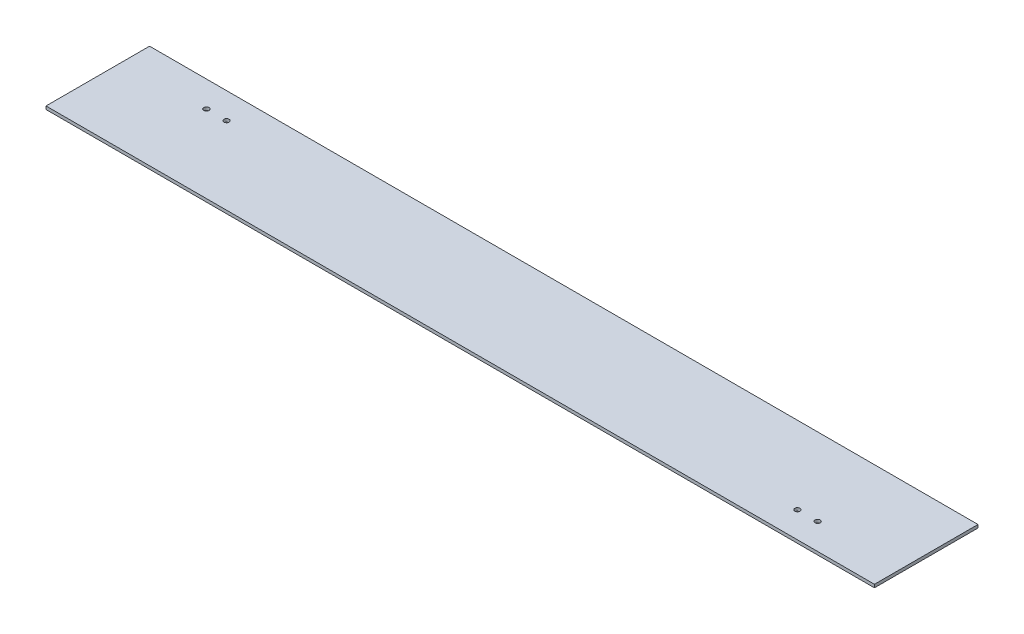
ISO-10303-21;
HEADER;
FILE_DESCRIPTION(('STEP AP214'),'2;1');
FILE_NAME('part.step','',(''),(''),'','','');
FILE_SCHEMA(('AUTOMOTIVE_DESIGN { 1 0 10303 214 1 1 1 1 }'));
ENDSEC;
DATA;
#1=APPLICATION_CONTEXT('core data for automotive mechanical design processes');
#2=APPLICATION_PROTOCOL_DEFINITION('international standard','automotive_design',2000,#1);
#3=PRODUCT_CONTEXT('',#1,'mechanical');
#4=PRODUCT('Part','Part','',(#3));
#5=PRODUCT_RELATED_PRODUCT_CATEGORY('part','',(#4));
#6=PRODUCT_DEFINITION_FORMATION('','',#4);
#7=PRODUCT_DEFINITION_CONTEXT('part definition',#1,'design');
#8=PRODUCT_DEFINITION('design','',#6,#7);
#9=PRODUCT_DEFINITION_SHAPE('','',#8);
#10=(LENGTH_UNIT() NAMED_UNIT(*) SI_UNIT(.MILLI.,.METRE.));
#11=(NAMED_UNIT(*) PLANE_ANGLE_UNIT() SI_UNIT($,.RADIAN.));
#12=(NAMED_UNIT(*) SI_UNIT($,.STERADIAN.) SOLID_ANGLE_UNIT());
#13=UNCERTAINTY_MEASURE_WITH_UNIT(LENGTH_MEASURE(1.E-05),#10,'distance_accuracy_value','');
#14=(GEOMETRIC_REPRESENTATION_CONTEXT(3) GLOBAL_UNCERTAINTY_ASSIGNED_CONTEXT((#13)) GLOBAL_UNIT_ASSIGNED_CONTEXT((#10,
#11,#12)) REPRESENTATION_CONTEXT('',''));
#15=CARTESIAN_POINT('',(0.,0.,0.));
#16=DIRECTION('',(0.,0.,1.));
#17=DIRECTION('',(1.,0.,0.));
#18=AXIS2_PLACEMENT_3D('',#15,#16,#17);
#19=CARTESIAN_POINT('',(0.,3.,0.));
#20=DIRECTION('',(-1.,0.,0.));
#21=DIRECTION('',(0.,0.,1.));
#22=AXIS2_PLACEMENT_3D('',#19,#20,#21);
#23=PLANE('',#22);
#24=DIRECTION('',(0.,0.,-1.));
#25=VECTOR('',#24,1.);
#26=CARTESIAN_POINT('',(0.,0.,0.));
#27=LINE('',#26,#25);
#28=CARTESIAN_POINT('',(0.,0.,0.));
#29=VERTEX_POINT('',#28);
#30=CARTESIAN_POINT('',(0.,0.,-100.));
#31=VERTEX_POINT('',#30);
#32=EDGE_CURVE('E103',#29,#31,#27,.T.);
#33=ORIENTED_EDGE('',*,*,#32,.T.);
#34=DIRECTION('',(0.,-1.,0.));
#35=VECTOR('',#34,1.);
#36=CARTESIAN_POINT('',(0.,3.,-100.));
#37=LINE('',#36,#35);
#38=CARTESIAN_POINT('',(0.,3.,-100.));
#39=VERTEX_POINT('',#38);
#40=EDGE_CURVE('E11',#39,#31,#37,.T.);
#41=ORIENTED_EDGE('',*,*,#40,.F.);
#42=DIRECTION('',(0.,0.,-1.));
#43=VECTOR('',#42,1.);
#44=CARTESIAN_POINT('',(0.,3.,0.));
#45=LINE('',#44,#43);
#46=CARTESIAN_POINT('',(0.,3.,0.));
#47=VERTEX_POINT('',#46);
#48=EDGE_CURVE('E90',#47,#39,#45,.T.);
#49=ORIENTED_EDGE('',*,*,#48,.F.);
#50=DIRECTION('',(0.,-1.,0.));
#51=VECTOR('',#50,1.);
#52=CARTESIAN_POINT('',(0.,3.,0.));
#53=LINE('',#52,#51);
#54=EDGE_CURVE('E99',#47,#29,#53,.T.);
#55=ORIENTED_EDGE('',*,*,#54,.T.);
#56=EDGE_LOOP('',(#33,#41,#49,#55));
#57=FACE_BOUND('',#56,.T.);
#58=ADVANCED_FACE('F37',(#57),#23,.F.);
#59=CARTESIAN_POINT('',(0.,3.,-100.));
#60=DIRECTION('',(0.,0.,1.));
#61=DIRECTION('',(1.,0.,0.));
#62=AXIS2_PLACEMENT_3D('',#59,#60,#61);
#63=PLANE('',#62);
#64=DIRECTION('',(-1.,0.,0.));
#65=VECTOR('',#64,1.);
#66=CARTESIAN_POINT('',(0.,0.,-100.));
#67=LINE('',#66,#65);
#68=CARTESIAN_POINT('',(-800.,0.,-99.9999999999999));
#69=VERTEX_POINT('',#68);
#70=EDGE_CURVE('E94',#31,#69,#67,.T.);
#71=ORIENTED_EDGE('',*,*,#70,.T.);
#72=DIRECTION('',(0.,-1.,0.));
#73=VECTOR('',#72,1.);
#74=CARTESIAN_POINT('',(-800.,3.,-99.9999999999999));
#75=LINE('',#74,#73);
#76=CARTESIAN_POINT('',(-800.,3.,-99.9999999999999));
#77=VERTEX_POINT('',#76);
#78=EDGE_CURVE('E46',#77,#69,#75,.T.);
#79=ORIENTED_EDGE('',*,*,#78,.F.);
#80=DIRECTION('',(-1.,0.,0.));
#81=VECTOR('',#80,1.);
#82=CARTESIAN_POINT('',(0.,3.,-100.));
#83=LINE('',#82,#81);
#84=EDGE_CURVE('E85',#39,#77,#83,.T.);
#85=ORIENTED_EDGE('',*,*,#84,.F.);
#86=ORIENTED_EDGE('',*,*,#40,.T.);
#87=EDGE_LOOP('',(#71,#79,#85,#86));
#88=FACE_BOUND('',#87,.T.);
#89=ADVANCED_FACE('F93',(#88),#63,.F.);
#90=CARTESIAN_POINT('',(-800.,3.,0.));
#91=DIRECTION('',(1.,0.,0.));
#92=DIRECTION('',(0.,0.,-1.));
#93=AXIS2_PLACEMENT_3D('',#90,#91,#92);
#94=PLANE('',#93);
#95=DIRECTION('',(0.,0.,1.));
#96=VECTOR('',#95,1.);
#97=CARTESIAN_POINT('',(-800.,0.,0.));
#98=LINE('',#97,#96);
#99=CARTESIAN_POINT('',(-800.,0.,0.));
#100=VERTEX_POINT('',#99);
#101=EDGE_CURVE('E72',#69,#100,#98,.T.);
#102=ORIENTED_EDGE('',*,*,#101,.T.);
#103=DIRECTION('',(0.,-1.,0.));
#104=VECTOR('',#103,1.);
#105=CARTESIAN_POINT('',(-800.,3.,0.));
#106=LINE('',#105,#104);
#107=CARTESIAN_POINT('',(-800.,3.,0.));
#108=VERTEX_POINT('',#107);
#109=EDGE_CURVE('E95',#108,#100,#106,.T.);
#110=ORIENTED_EDGE('',*,*,#109,.F.);
#111=DIRECTION('',(0.,0.,1.));
#112=VECTOR('',#111,1.);
#113=CARTESIAN_POINT('',(-800.,3.,0.));
#114=LINE('',#113,#112);
#115=EDGE_CURVE('E88',#77,#108,#114,.T.);
#116=ORIENTED_EDGE('',*,*,#115,.F.);
#117=ORIENTED_EDGE('',*,*,#78,.T.);
#118=EDGE_LOOP('',(#102,#110,#116,#117));
#119=FACE_BOUND('',#118,.T.);
#120=ADVANCED_FACE('F97',(#119),#94,.F.);
#121=CARTESIAN_POINT('',(0.,3.,0.));
#122=DIRECTION('',(0.,0.,-1.));
#123=DIRECTION('',(-1.,0.,0.));
#124=AXIS2_PLACEMENT_3D('',#121,#122,#123);
#125=PLANE('',#124);
#126=DIRECTION('',(1.,0.,0.));
#127=VECTOR('',#126,1.);
#128=CARTESIAN_POINT('',(0.,0.,0.));
#129=LINE('',#128,#127);
#130=EDGE_CURVE('E78',#100,#29,#129,.T.);
#131=ORIENTED_EDGE('',*,*,#130,.T.);
#132=ORIENTED_EDGE('',*,*,#54,.F.);
#133=DIRECTION('',(1.,0.,0.));
#134=VECTOR('',#133,1.);
#135=CARTESIAN_POINT('',(0.,3.,0.));
#136=LINE('',#135,#134);
#137=EDGE_CURVE('E55',#108,#47,#136,.T.);
#138=ORIENTED_EDGE('',*,*,#137,.F.);
#139=ORIENTED_EDGE('',*,*,#109,.T.);
#140=EDGE_LOOP('',(#131,#132,#138,#139));
#141=FACE_BOUND('',#140,.T.);
#142=ADVANCED_FACE('F154',(#141),#125,.F.);
#143=CARTESIAN_POINT('',(0.,3.,0.));
#144=DIRECTION('',(0.,1.,0.));
#145=DIRECTION('',(0.,0.,1.));
#146=AXIS2_PLACEMENT_3D('',#143,#144,#145);
#147=PLANE('',#146);
#148=CARTESIAN_POINT('',(-80.,3.,-25.1399999999999));
#149=DIRECTION('',(0.,1.,0.));
#150=DIRECTION('',(0.,0.,1.));
#151=AXIS2_PLACEMENT_3D('',#148,#149,#150);
#152=CIRCLE('',#151,2.50000000000001);
#153=CARTESIAN_POINT('',(-80.,3.,-22.6399999999999));
#154=VERTEX_POINT('',#153);
#155=EDGE_CURVE('E115',#154,#154,#152,.T.);
#156=ORIENTED_EDGE('',*,*,#155,.F.);
#157=EDGE_LOOP('',(#156));
#158=FACE_BOUND('',#157,.T.);
#159=CARTESIAN_POINT('',(-700.5,3.,-74.86));
#160=DIRECTION('',(0.,1.,0.));
#161=DIRECTION('',(0.,0.,1.));
#162=AXIS2_PLACEMENT_3D('',#159,#160,#161);
#163=CIRCLE('',#162,2.49999999999991);
#164=CARTESIAN_POINT('',(-700.5,3.,-72.3600000000001));
#165=VERTEX_POINT('',#164);
#166=EDGE_CURVE('E249',#165,#165,#163,.T.);
#167=ORIENTED_EDGE('',*,*,#166,.F.);
#168=EDGE_LOOP('',(#167));
#169=FACE_BOUND('',#168,.T.);
#170=CARTESIAN_POINT('',(-720.,3.,-74.86));
#171=DIRECTION('',(0.,1.,0.));
#172=DIRECTION('',(0.,0.,1.));
#173=AXIS2_PLACEMENT_3D('',#170,#171,#172);
#174=CIRCLE('',#173,2.49999999999991);
#175=CARTESIAN_POINT('',(-720.,3.,-72.3600000000001));
#176=VERTEX_POINT('',#175);
#177=EDGE_CURVE('E241',#176,#176,#174,.T.);
#178=ORIENTED_EDGE('',*,*,#177,.F.);
#179=EDGE_LOOP('',(#178));
#180=FACE_BOUND('',#179,.T.);
#181=CARTESIAN_POINT('',(-99.5,3.,-25.1399999999999));
#182=DIRECTION('',(0.,1.,0.));
#183=DIRECTION('',(0.,0.,1.));
#184=AXIS2_PLACEMENT_3D('',#181,#182,#183);
#185=CIRCLE('',#184,2.5);
#186=CARTESIAN_POINT('',(-99.5,3.,-22.6399999999999));
#187=VERTEX_POINT('',#186);
#188=EDGE_CURVE('E248',#187,#187,#185,.T.);
#189=ORIENTED_EDGE('',*,*,#188,.F.);
#190=EDGE_LOOP('',(#189));
#191=FACE_BOUND('',#190,.T.);
#192=ORIENTED_EDGE('',*,*,#48,.T.);
#193=ORIENTED_EDGE('',*,*,#84,.T.);
#194=ORIENTED_EDGE('',*,*,#115,.T.);
#195=ORIENTED_EDGE('',*,*,#137,.T.);
#196=EDGE_LOOP('',(#192,#193,#194,#195));
#197=FACE_BOUND('',#196,.T.);
#198=ADVANCED_FACE('F86',(#158,#169,#180,#191,#197),#147,.T.);
#199=CARTESIAN_POINT('',(0.,0.,0.));
#200=DIRECTION('',(0.,1.,0.));
#201=DIRECTION('',(0.,0.,1.));
#202=AXIS2_PLACEMENT_3D('',#199,#200,#201);
#203=PLANE('',#202);
#204=CARTESIAN_POINT('',(-80.,0.,-25.1399999999999));
#205=DIRECTION('',(0.,1.,0.));
#206=DIRECTION('',(0.,0.,1.));
#207=AXIS2_PLACEMENT_3D('',#204,#205,#206);
#208=CIRCLE('',#207,2.50000000000001);
#209=CARTESIAN_POINT('',(-80.,0.,-22.6399999999999));
#210=VERTEX_POINT('',#209);
#211=EDGE_CURVE('E40',#210,#210,#208,.T.);
#212=ORIENTED_EDGE('',*,*,#211,.T.);
#213=EDGE_LOOP('',(#212));
#214=FACE_BOUND('',#213,.T.);
#215=CARTESIAN_POINT('',(-700.5,0.,-74.86));
#216=DIRECTION('',(0.,1.,0.));
#217=DIRECTION('',(0.,0.,1.));
#218=AXIS2_PLACEMENT_3D('',#215,#216,#217);
#219=CIRCLE('',#218,2.49999999999991);
#220=CARTESIAN_POINT('',(-700.5,0.,-72.3600000000001));
#221=VERTEX_POINT('',#220);
#222=EDGE_CURVE('E117',#221,#221,#219,.T.);
#223=ORIENTED_EDGE('',*,*,#222,.T.);
#224=EDGE_LOOP('',(#223));
#225=FACE_BOUND('',#224,.T.);
#226=CARTESIAN_POINT('',(-720.,0.,-74.86));
#227=DIRECTION('',(0.,1.,0.));
#228=DIRECTION('',(0.,0.,1.));
#229=AXIS2_PLACEMENT_3D('',#226,#227,#228);
#230=CIRCLE('',#229,2.49999999999991);
#231=CARTESIAN_POINT('',(-720.,0.,-72.3600000000001));
#232=VERTEX_POINT('',#231);
#233=EDGE_CURVE('E114',#232,#232,#230,.T.);
#234=ORIENTED_EDGE('',*,*,#233,.T.);
#235=EDGE_LOOP('',(#234));
#236=FACE_BOUND('',#235,.T.);
#237=CARTESIAN_POINT('',(-99.5,0.,-25.1399999999999));
#238=DIRECTION('',(0.,1.,0.));
#239=DIRECTION('',(0.,0.,1.));
#240=AXIS2_PLACEMENT_3D('',#237,#238,#239);
#241=CIRCLE('',#240,2.5);
#242=CARTESIAN_POINT('',(-99.5,0.,-22.6399999999999));
#243=VERTEX_POINT('',#242);
#244=EDGE_CURVE('E111',#243,#243,#241,.T.);
#245=ORIENTED_EDGE('',*,*,#244,.T.);
#246=EDGE_LOOP('',(#245));
#247=FACE_BOUND('',#246,.T.);
#248=ORIENTED_EDGE('',*,*,#32,.F.);
#249=ORIENTED_EDGE('',*,*,#130,.F.);
#250=ORIENTED_EDGE('',*,*,#101,.F.);
#251=ORIENTED_EDGE('',*,*,#70,.F.);
#252=EDGE_LOOP('',(#248,#249,#250,#251));
#253=FACE_BOUND('',#252,.T.);
#254=ADVANCED_FACE('F124',(#214,#225,#236,#247,#253),#203,.F.);
#255=CARTESIAN_POINT('',(-99.5,-37.,-25.1399999999999));
#256=DIRECTION('',(0.,1.,0.));
#257=DIRECTION('',(0.,0.,1.));
#258=AXIS2_PLACEMENT_3D('',#255,#256,#257);
#259=CYLINDRICAL_SURFACE('',#258,2.5);
#260=ORIENTED_EDGE('',*,*,#188,.T.);
#261=EDGE_LOOP('',(#260));
#262=FACE_BOUND('',#261,.T.);
#263=ORIENTED_EDGE('',*,*,#244,.F.);
#264=EDGE_LOOP('',(#263));
#265=FACE_BOUND('',#264,.T.);
#266=ADVANCED_FACE('F146',(#262,#265),#259,.F.);
#267=CARTESIAN_POINT('',(-720.,-37.,-74.86));
#268=DIRECTION('',(0.,1.,0.));
#269=DIRECTION('',(0.,0.,1.));
#270=AXIS2_PLACEMENT_3D('',#267,#268,#269);
#271=CYLINDRICAL_SURFACE('',#270,2.49999999999991);
#272=ORIENTED_EDGE('',*,*,#177,.T.);
#273=EDGE_LOOP('',(#272));
#274=FACE_BOUND('',#273,.T.);
#275=ORIENTED_EDGE('',*,*,#233,.F.);
#276=EDGE_LOOP('',(#275));
#277=FACE_BOUND('',#276,.T.);
#278=ADVANCED_FACE('F134',(#274,#277),#271,.F.);
#279=CARTESIAN_POINT('',(-700.5,-37.,-74.86));
#280=DIRECTION('',(0.,1.,0.));
#281=DIRECTION('',(0.,0.,1.));
#282=AXIS2_PLACEMENT_3D('',#279,#280,#281);
#283=CYLINDRICAL_SURFACE('',#282,2.49999999999991);
#284=ORIENTED_EDGE('',*,*,#166,.T.);
#285=EDGE_LOOP('',(#284));
#286=FACE_BOUND('',#285,.T.);
#287=ORIENTED_EDGE('',*,*,#222,.F.);
#288=EDGE_LOOP('',(#287));
#289=FACE_BOUND('',#288,.T.);
#290=ADVANCED_FACE('F128',(#286,#289),#283,.F.);
#291=CARTESIAN_POINT('',(-80.,-37.,-25.1399999999999));
#292=DIRECTION('',(0.,1.,0.));
#293=DIRECTION('',(0.,0.,1.));
#294=AXIS2_PLACEMENT_3D('',#291,#292,#293);
#295=CYLINDRICAL_SURFACE('',#294,2.50000000000001);
#296=ORIENTED_EDGE('',*,*,#155,.T.);
#297=EDGE_LOOP('',(#296));
#298=FACE_BOUND('',#297,.T.);
#299=ORIENTED_EDGE('',*,*,#211,.F.);
#300=EDGE_LOOP('',(#299));
#301=FACE_BOUND('',#300,.T.);
#302=ADVANCED_FACE('F126',(#298,#301),#295,.F.);
#303=CLOSED_SHELL('',(#58,#89,#120,#142,#198,#254,#266,#278,#290,#302));
#304=MANIFOLD_SOLID_BREP('B2',#303);
#305=ADVANCED_BREP_SHAPE_REPRESENTATION('',(#18,#304),#14);
#306=SHAPE_DEFINITION_REPRESENTATION(#9,#305);
ENDSEC;
END-ISO-10303-21;
